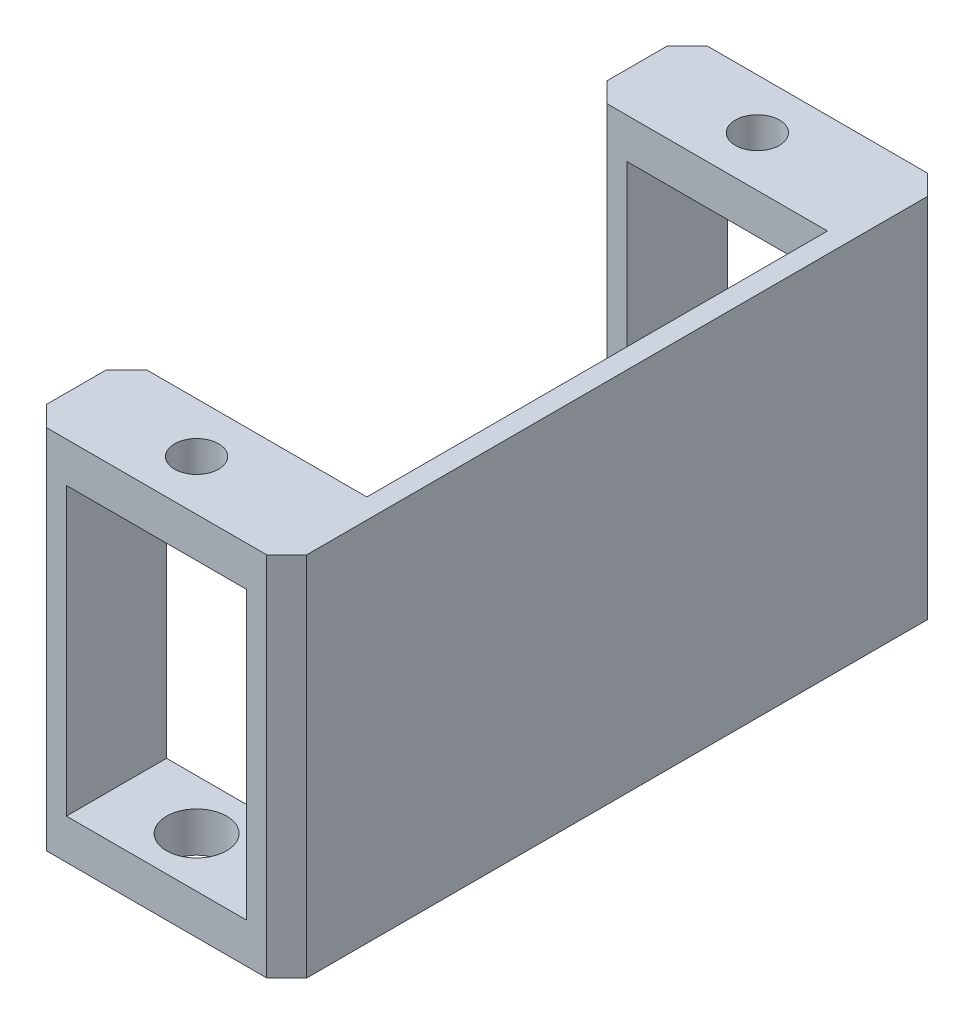
ISO-10303-21;
HEADER;
FILE_DESCRIPTION(('STEP AP214'),'2;1');
FILE_NAME('part.step','',(''),(''),'','','');
FILE_SCHEMA(('AUTOMOTIVE_DESIGN { 1 0 10303 214 1 1 1 1 }'));
ENDSEC;
DATA;
#1=APPLICATION_CONTEXT('core data for automotive mechanical design processes');
#2=APPLICATION_PROTOCOL_DEFINITION('international standard','automotive_design',2000,#1);
#3=PRODUCT_CONTEXT('',#1,'mechanical');
#4=PRODUCT('Part','Part','',(#3));
#5=PRODUCT_RELATED_PRODUCT_CATEGORY('part','',(#4));
#6=PRODUCT_DEFINITION_FORMATION('','',#4);
#7=PRODUCT_DEFINITION_CONTEXT('part definition',#1,'design');
#8=PRODUCT_DEFINITION('design','',#6,#7);
#9=PRODUCT_DEFINITION_SHAPE('','',#8);
#10=(LENGTH_UNIT() NAMED_UNIT(*) SI_UNIT(.MILLI.,.METRE.));
#11=(NAMED_UNIT(*) PLANE_ANGLE_UNIT() SI_UNIT($,.RADIAN.));
#12=(NAMED_UNIT(*) SI_UNIT($,.STERADIAN.) SOLID_ANGLE_UNIT());
#13=UNCERTAINTY_MEASURE_WITH_UNIT(LENGTH_MEASURE(1.E-05),#10,'distance_accuracy_value','');
#14=(GEOMETRIC_REPRESENTATION_CONTEXT(3) GLOBAL_UNCERTAINTY_ASSIGNED_CONTEXT((#13)) GLOBAL_UNIT_ASSIGNED_CONTEXT((#10,
#11,#12)) REPRESENTATION_CONTEXT('',''));
#15=CARTESIAN_POINT('',(0.,0.,0.));
#16=DIRECTION('',(0.,0.,1.));
#17=DIRECTION('',(1.,0.,0.));
#18=AXIS2_PLACEMENT_3D('',#15,#16,#17);
#19=CARTESIAN_POINT('',(0.,2.,0.));
#20=DIRECTION('',(0.,1.,0.));
#21=DIRECTION('',(0.,0.,1.));
#22=AXIS2_PLACEMENT_3D('',#19,#20,#21);
#23=PLANE('',#22);
#24=CARTESIAN_POINT('',(0.,2.,14.));
#25=DIRECTION('',(0.,1.,0.));
#26=DIRECTION('',(0.,0.,1.));
#27=AXIS2_PLACEMENT_3D('',#24,#25,#26);
#28=CIRCLE('',#27,1.5);
#29=CARTESIAN_POINT('',(0.,2.,15.5));
#30=VERTEX_POINT('',#29);
#31=EDGE_CURVE('E333',#30,#30,#28,.T.);
#32=ORIENTED_EDGE('',*,*,#31,.F.);
#33=EDGE_LOOP('',(#32));
#34=FACE_BOUND('',#33,.T.);
#35=DIRECTION('',(-1.,0.,0.));
#36=VECTOR('',#35,1.);
#37=CARTESIAN_POINT('',(-6.,2.,11.5));
#38=LINE('',#37,#36);
#39=CARTESIAN_POINT('',(5.00000000000001,2.,11.5));
#40=VERTEX_POINT('',#39);
#41=CARTESIAN_POINT('',(-4.00000000000001,2.,11.5));
#42=VERTEX_POINT('',#41);
#43=EDGE_CURVE('E349',#40,#42,#38,.T.);
#44=ORIENTED_EDGE('',*,*,#43,.T.);
#45=DIRECTION('',(0.,0.,-1.));
#46=VECTOR('',#45,1.);
#47=CARTESIAN_POINT('',(-4.00000000000001,2.,16.5));
#48=LINE('',#47,#46);
#49=CARTESIAN_POINT('',(-4.00000000000001,2.,16.5));
#50=VERTEX_POINT('',#49);
#51=EDGE_CURVE('E277',#50,#42,#48,.T.);
#52=ORIENTED_EDGE('',*,*,#51,.F.);
#53=DIRECTION('',(1.,0.,0.));
#54=VECTOR('',#53,1.);
#55=CARTESIAN_POINT('',(-6.,2.,16.5));
#56=LINE('',#55,#54);
#57=CARTESIAN_POINT('',(5.00000000000001,2.,16.5));
#58=VERTEX_POINT('',#57);
#59=EDGE_CURVE('E352',#50,#58,#56,.T.);
#60=ORIENTED_EDGE('',*,*,#59,.T.);
#61=DIRECTION('',(0.,0.,1.));
#62=VECTOR('',#61,1.);
#63=CARTESIAN_POINT('',(5.00000000000001,2.,16.5));
#64=LINE('',#63,#62);
#65=EDGE_CURVE('E301',#40,#58,#64,.T.);
#66=ORIENTED_EDGE('',*,*,#65,.F.);
#67=EDGE_LOOP('',(#44,#52,#60,#66));
#68=FACE_BOUND('',#67,.T.);
#69=ADVANCED_FACE('F47',(#34,#68),#23,.T.);
#70=CARTESIAN_POINT('',(0.,2.,-14.));
#71=DIRECTION('',(0.,1.,0.));
#72=DIRECTION('',(0.,0.,-1.));
#73=AXIS2_PLACEMENT_3D('',#70,#71,#72);
#74=CIRCLE('',#73,1.5);
#75=CARTESIAN_POINT('',(0.,2.,-15.5));
#76=VERTEX_POINT('',#75);
#77=EDGE_CURVE('E338',#76,#76,#74,.T.);
#78=ORIENTED_EDGE('',*,*,#77,.F.);
#79=EDGE_LOOP('',(#78));
#80=FACE_BOUND('',#79,.T.);
#81=DIRECTION('',(1.,0.,0.));
#82=VECTOR('',#81,1.);
#83=CARTESIAN_POINT('',(-6.,2.,-11.5));
#84=LINE('',#83,#82);
#85=CARTESIAN_POINT('',(-4.00000000000001,2.,-11.5));
#86=VERTEX_POINT('',#85);
#87=CARTESIAN_POINT('',(5.00000000000001,2.,-11.5));
#88=VERTEX_POINT('',#87);
#89=EDGE_CURVE('E224',#86,#88,#84,.T.);
#90=ORIENTED_EDGE('',*,*,#89,.T.);
#91=DIRECTION('',(0.,0.,1.));
#92=VECTOR('',#91,1.);
#93=CARTESIAN_POINT('',(5.00000000000001,2.,-16.5));
#94=LINE('',#93,#92);
#95=CARTESIAN_POINT('',(5.00000000000001,2.,-16.5));
#96=VERTEX_POINT('',#95);
#97=EDGE_CURVE('E305',#96,#88,#94,.T.);
#98=ORIENTED_EDGE('',*,*,#97,.F.);
#99=DIRECTION('',(-1.,0.,0.));
#100=VECTOR('',#99,1.);
#101=CARTESIAN_POINT('',(6.00000000000001,2.,-16.5));
#102=LINE('',#101,#100);
#103=CARTESIAN_POINT('',(-4.00000000000001,2.,-16.5));
#104=VERTEX_POINT('',#103);
#105=EDGE_CURVE('E355',#96,#104,#102,.T.);
#106=ORIENTED_EDGE('',*,*,#105,.T.);
#107=DIRECTION('',(0.,0.,-1.));
#108=VECTOR('',#107,1.);
#109=CARTESIAN_POINT('',(-4.00000000000001,2.,-16.5));
#110=LINE('',#109,#108);
#111=EDGE_CURVE('E310',#86,#104,#110,.T.);
#112=ORIENTED_EDGE('',*,*,#111,.F.);
#113=EDGE_LOOP('',(#90,#98,#106,#112));
#114=FACE_BOUND('',#113,.T.);
#115=ADVANCED_FACE('F498',(#80,#114),#23,.T.);
#116=CARTESIAN_POINT('',(6.,2.,-11.5));
#117=DIRECTION('',(1.,0.,0.));
#118=DIRECTION('',(0.,0.,-1.));
#119=AXIS2_PLACEMENT_3D('',#116,#117,#118);
#120=PLANE('',#119);
#121=DIRECTION('',(0.,0.,1.));
#122=VECTOR('',#121,1.);
#123=CARTESIAN_POINT('',(6.,0.,-11.5));
#124=LINE('',#123,#122);
#125=CARTESIAN_POINT('',(6.,0.,-11.5));
#126=VERTEX_POINT('',#125);
#127=CARTESIAN_POINT('',(6.,0.,11.5));
#128=VERTEX_POINT('',#127);
#129=EDGE_CURVE('E342',#126,#128,#124,.T.);
#130=ORIENTED_EDGE('',*,*,#129,.T.);
#131=DIRECTION('',(0.,-1.,0.));
#132=VECTOR('',#131,1.);
#133=CARTESIAN_POINT('',(6.,2.,11.5));
#134=LINE('',#133,#132);
#135=CARTESIAN_POINT('',(6.,18.3,11.5));
#136=VERTEX_POINT('',#135);
#137=EDGE_CURVE('E223',#136,#128,#134,.T.);
#138=ORIENTED_EDGE('',*,*,#137,.F.);
#139=DIRECTION('',(0.,0.,1.));
#140=VECTOR('',#139,1.);
#141=CARTESIAN_POINT('',(6.,18.3,-11.5));
#142=LINE('',#141,#140);
#143=CARTESIAN_POINT('',(6.,18.3,-11.5));
#144=VERTEX_POINT('',#143);
#145=EDGE_CURVE('E204',#144,#136,#142,.T.);
#146=ORIENTED_EDGE('',*,*,#145,.F.);
#147=DIRECTION('',(0.,-1.,0.));
#148=VECTOR('',#147,1.);
#149=CARTESIAN_POINT('',(6.,2.,-11.5));
#150=LINE('',#149,#148);
#151=EDGE_CURVE('E215',#144,#126,#150,.T.);
#152=ORIENTED_EDGE('',*,*,#151,.T.);
#153=EDGE_LOOP('',(#130,#138,#146,#152));
#154=FACE_BOUND('',#153,.T.);
#155=ADVANCED_FACE('F226',(#154),#120,.F.);
#156=CARTESIAN_POINT('',(-6.,2.,11.5));
#157=DIRECTION('',(0.,0.,1.));
#158=DIRECTION('',(1.,0.,0.));
#159=AXIS2_PLACEMENT_3D('',#156,#157,#158);
#160=PLANE('',#159);
#161=DIRECTION('',(0.,-1.,0.));
#162=VECTOR('',#161,1.);
#163=CARTESIAN_POINT('',(5.00000000000001,16.3,11.5));
#164=LINE('',#163,#162);
#165=CARTESIAN_POINT('',(5.00000000000001,16.3,11.5));
#166=VERTEX_POINT('',#165);
#167=EDGE_CURVE('E292',#166,#40,#164,.T.);
#168=ORIENTED_EDGE('',*,*,#167,.F.);
#169=DIRECTION('',(-1.,0.,0.));
#170=VECTOR('',#169,1.);
#171=CARTESIAN_POINT('',(-6.00000000000001,16.3,11.5));
#172=LINE('',#171,#170);
#173=CARTESIAN_POINT('',(-4.00000000000001,16.3,11.5));
#174=VERTEX_POINT('',#173);
#175=EDGE_CURVE('E257',#166,#174,#172,.T.);
#176=ORIENTED_EDGE('',*,*,#175,.T.);
#177=DIRECTION('',(0.,-1.,0.));
#178=VECTOR('',#177,1.);
#179=CARTESIAN_POINT('',(-4.00000000000001,16.3,11.5));
#180=LINE('',#179,#178);
#181=EDGE_CURVE('E272',#174,#42,#180,.T.);
#182=ORIENTED_EDGE('',*,*,#181,.T.);
#183=ORIENTED_EDGE('',*,*,#43,.F.);
#184=EDGE_LOOP('',(#168,#176,#182,#183));
#185=FACE_BOUND('',#184,.T.);
#186=DIRECTION('',(-1.,0.,0.));
#187=VECTOR('',#186,1.);
#188=CARTESIAN_POINT('',(-6.,0.,11.5));
#189=LINE('',#188,#187);
#190=CARTESIAN_POINT('',(-4.99999999999999,0.,11.5));
#191=VERTEX_POINT('',#190);
#192=EDGE_CURVE('E362',#128,#191,#189,.T.);
#193=ORIENTED_EDGE('',*,*,#192,.T.);
#194=DIRECTION('',(0.,1.,0.));
#195=VECTOR('',#194,1.);
#196=CARTESIAN_POINT('',(-4.99999999999999,2.,11.5));
#197=LINE('',#196,#195);
#198=CARTESIAN_POINT('',(-4.99999999999999,18.3,11.5));
#199=VERTEX_POINT('',#198);
#200=EDGE_CURVE('E437',#191,#199,#197,.T.);
#201=ORIENTED_EDGE('',*,*,#200,.T.);
#202=DIRECTION('',(-1.,0.,0.));
#203=VECTOR('',#202,1.);
#204=CARTESIAN_POINT('',(-6.00000000000001,18.3,11.5));
#205=LINE('',#204,#203);
#206=EDGE_CURVE('E229',#136,#199,#205,.T.);
#207=ORIENTED_EDGE('',*,*,#206,.F.);
#208=ORIENTED_EDGE('',*,*,#137,.T.);
#209=EDGE_LOOP('',(#193,#201,#207,#208));
#210=FACE_BOUND('',#209,.T.);
#211=ADVANCED_FACE('F531',(#185,#210),#160,.F.);
#212=CARTESIAN_POINT('',(-6.,2.,11.5));
#213=DIRECTION('',(1.,0.,0.));
#214=DIRECTION('',(0.,0.,-1.));
#215=AXIS2_PLACEMENT_3D('',#212,#213,#214);
#216=PLANE('',#215);
#217=DIRECTION('',(0.,0.,1.));
#218=VECTOR('',#217,1.);
#219=CARTESIAN_POINT('',(-6.,0.,11.5));
#220=LINE('',#219,#218);
#221=CARTESIAN_POINT('',(-6.,0.,12.5));
#222=VERTEX_POINT('',#221);
#223=CARTESIAN_POINT('',(-6.,0.,15.5));
#224=VERTEX_POINT('',#223);
#225=EDGE_CURVE('E366',#222,#224,#220,.T.);
#226=ORIENTED_EDGE('',*,*,#225,.T.);
#227=DIRECTION('',(0.,1.,0.));
#228=VECTOR('',#227,1.);
#229=CARTESIAN_POINT('',(-6.,2.,15.5));
#230=LINE('',#229,#228);
#231=CARTESIAN_POINT('',(-6.00000000000001,18.3,15.5));
#232=VERTEX_POINT('',#231);
#233=EDGE_CURVE('E418',#224,#232,#230,.T.);
#234=ORIENTED_EDGE('',*,*,#233,.T.);
#235=DIRECTION('',(0.,0.,1.));
#236=VECTOR('',#235,1.);
#237=CARTESIAN_POINT('',(-6.00000000000001,18.3,11.5));
#238=LINE('',#237,#236);
#239=CARTESIAN_POINT('',(-6.00000000000001,18.3,12.5));
#240=VERTEX_POINT('',#239);
#241=EDGE_CURVE('E232',#240,#232,#238,.T.);
#242=ORIENTED_EDGE('',*,*,#241,.F.);
#243=DIRECTION('',(0.,-1.,0.));
#244=VECTOR('',#243,1.);
#245=CARTESIAN_POINT('',(-6.,2.,12.5));
#246=LINE('',#245,#244);
#247=EDGE_CURVE('E414',#240,#222,#246,.T.);
#248=ORIENTED_EDGE('',*,*,#247,.T.);
#249=EDGE_LOOP('',(#226,#234,#242,#248));
#250=FACE_BOUND('',#249,.T.);
#251=ADVANCED_FACE('F527',(#250),#216,.F.);
#252=CARTESIAN_POINT('',(6.00000000000001,2.,16.5));
#253=DIRECTION('',(0.,0.,-1.));
#254=DIRECTION('',(-1.,0.,0.));
#255=AXIS2_PLACEMENT_3D('',#252,#253,#254);
#256=PLANE('',#255);
#257=DIRECTION('',(1.,0.,0.));
#258=VECTOR('',#257,1.);
#259=CARTESIAN_POINT('',(-6.00000000000001,18.3,16.5));
#260=LINE('',#259,#258);
#261=CARTESIAN_POINT('',(-5.,18.3,16.5));
#262=VERTEX_POINT('',#261);
#263=CARTESIAN_POINT('',(6.,18.3,16.5));
#264=VERTEX_POINT('',#263);
#265=EDGE_CURVE('E238',#262,#264,#260,.T.);
#266=ORIENTED_EDGE('',*,*,#265,.F.);
#267=DIRECTION('',(0.,-1.,0.));
#268=VECTOR('',#267,1.);
#269=CARTESIAN_POINT('',(-5.,2.,16.5));
#270=LINE('',#269,#268);
#271=CARTESIAN_POINT('',(-5.,0.,16.5));
#272=VERTEX_POINT('',#271);
#273=EDGE_CURVE('E392',#262,#272,#270,.T.);
#274=ORIENTED_EDGE('',*,*,#273,.T.);
#275=DIRECTION('',(1.,0.,0.));
#276=VECTOR('',#275,1.);
#277=CARTESIAN_POINT('',(6.00000000000001,0.,16.5));
#278=LINE('',#277,#276);
#279=CARTESIAN_POINT('',(6.,0.,16.5));
#280=VERTEX_POINT('',#279);
#281=EDGE_CURVE('E370',#272,#280,#278,.T.);
#282=ORIENTED_EDGE('',*,*,#281,.T.);
#283=DIRECTION('',(0.,1.,0.));
#284=VECTOR('',#283,1.);
#285=CARTESIAN_POINT('',(6.,2.,16.5));
#286=LINE('',#285,#284);
#287=EDGE_CURVE('E389',#280,#264,#286,.T.);
#288=ORIENTED_EDGE('',*,*,#287,.T.);
#289=EDGE_LOOP('',(#266,#274,#282,#288));
#290=FACE_BOUND('',#289,.T.);
#291=DIRECTION('',(1.,0.,0.));
#292=VECTOR('',#291,1.);
#293=CARTESIAN_POINT('',(-6.00000000000001,16.3,16.5));
#294=LINE('',#293,#292);
#295=CARTESIAN_POINT('',(-4.00000000000001,16.3,16.5));
#296=VERTEX_POINT('',#295);
#297=CARTESIAN_POINT('',(5.00000000000001,16.3,16.5));
#298=VERTEX_POINT('',#297);
#299=EDGE_CURVE('E262',#296,#298,#294,.T.);
#300=ORIENTED_EDGE('',*,*,#299,.T.);
#301=DIRECTION('',(0.,-1.,0.));
#302=VECTOR('',#301,1.);
#303=CARTESIAN_POINT('',(5.00000000000001,16.3,16.5));
#304=LINE('',#303,#302);
#305=EDGE_CURVE('E296',#298,#58,#304,.T.);
#306=ORIENTED_EDGE('',*,*,#305,.T.);
#307=ORIENTED_EDGE('',*,*,#59,.F.);
#308=DIRECTION('',(0.,-1.,0.));
#309=VECTOR('',#308,1.);
#310=CARTESIAN_POINT('',(-4.00000000000001,16.3,16.5));
#311=LINE('',#310,#309);
#312=EDGE_CURVE('E252',#296,#50,#311,.T.);
#313=ORIENTED_EDGE('',*,*,#312,.F.);
#314=EDGE_LOOP('',(#300,#306,#307,#313));
#315=FACE_BOUND('',#314,.T.);
#316=ADVANCED_FACE('F524',(#290,#315),#256,.F.);
#317=CARTESIAN_POINT('',(7.00000000000001,2.,-16.5));
#318=DIRECTION('',(-1.,0.,0.));
#319=DIRECTION('',(0.,0.,1.));
#320=AXIS2_PLACEMENT_3D('',#317,#318,#319);
#321=PLANE('',#320);
#322=DIRECTION('',(0.,0.,-1.));
#323=VECTOR('',#322,1.);
#324=CARTESIAN_POINT('',(7.00000000000001,0.,-16.5));
#325=LINE('',#324,#323);
#326=CARTESIAN_POINT('',(7.00000000000001,0.,15.5));
#327=VERTEX_POINT('',#326);
#328=CARTESIAN_POINT('',(7.00000000000001,0.,-15.5));
#329=VERTEX_POINT('',#328);
#330=EDGE_CURVE('E374',#327,#329,#325,.T.);
#331=ORIENTED_EDGE('',*,*,#330,.T.);
#332=DIRECTION('',(0.,1.,0.));
#333=VECTOR('',#332,1.);
#334=CARTESIAN_POINT('',(7.00000000000001,2.,-15.5));
#335=LINE('',#334,#333);
#336=CARTESIAN_POINT('',(7.00000000000001,18.3,-15.5));
#337=VERTEX_POINT('',#336);
#338=EDGE_CURVE('E11',#329,#337,#335,.T.);
#339=ORIENTED_EDGE('',*,*,#338,.T.);
#340=DIRECTION('',(0.,0.,-1.));
#341=VECTOR('',#340,1.);
#342=CARTESIAN_POINT('',(7.00000000000001,18.3,16.5));
#343=LINE('',#342,#341);
#344=CARTESIAN_POINT('',(7.00000000000001,18.3,15.5));
#345=VERTEX_POINT('',#344);
#346=EDGE_CURVE('E242',#345,#337,#343,.T.);
#347=ORIENTED_EDGE('',*,*,#346,.F.);
#348=DIRECTION('',(0.,-1.,0.));
#349=VECTOR('',#348,1.);
#350=CARTESIAN_POINT('',(7.00000000000001,2.,15.5));
#351=LINE('',#350,#349);
#352=EDGE_CURVE('E57',#345,#327,#351,.T.);
#353=ORIENTED_EDGE('',*,*,#352,.T.);
#354=EDGE_LOOP('',(#331,#339,#347,#353));
#355=FACE_BOUND('',#354,.T.);
#356=ADVANCED_FACE('F461',(#355),#321,.F.);
#357=CARTESIAN_POINT('',(-6.00000000000001,2.,-16.5));
#358=DIRECTION('',(0.,0.,1.));
#359=DIRECTION('',(1.,0.,0.));
#360=AXIS2_PLACEMENT_3D('',#357,#358,#359);
#361=PLANE('',#360);
#362=DIRECTION('',(-1.,0.,0.));
#363=VECTOR('',#362,1.);
#364=CARTESIAN_POINT('',(-6.00000000000001,0.,-16.5));
#365=LINE('',#364,#363);
#366=CARTESIAN_POINT('',(6.,0.,-16.5));
#367=VERTEX_POINT('',#366);
#368=CARTESIAN_POINT('',(-5.,0.,-16.5));
#369=VERTEX_POINT('',#368);
#370=EDGE_CURVE('E378',#367,#369,#365,.T.);
#371=ORIENTED_EDGE('',*,*,#370,.T.);
#372=DIRECTION('',(0.,1.,0.));
#373=VECTOR('',#372,1.);
#374=CARTESIAN_POINT('',(-5.,2.,-16.5));
#375=LINE('',#374,#373);
#376=CARTESIAN_POINT('',(-5.,18.3,-16.5));
#377=VERTEX_POINT('',#376);
#378=EDGE_CURVE('E453',#369,#377,#375,.T.);
#379=ORIENTED_EDGE('',*,*,#378,.T.);
#380=DIRECTION('',(-1.,0.,0.));
#381=VECTOR('',#380,1.);
#382=CARTESIAN_POINT('',(-6.00000000000001,18.3,-16.5));
#383=LINE('',#382,#381);
#384=CARTESIAN_POINT('',(6.,18.3,-16.5));
#385=VERTEX_POINT('',#384);
#386=EDGE_CURVE('E246',#385,#377,#383,.T.);
#387=ORIENTED_EDGE('',*,*,#386,.F.);
#388=DIRECTION('',(0.,-1.,0.));
#389=VECTOR('',#388,1.);
#390=CARTESIAN_POINT('',(6.,2.,-16.5));
#391=LINE('',#390,#389);
#392=EDGE_CURVE('E449',#385,#367,#391,.T.);
#393=ORIENTED_EDGE('',*,*,#392,.T.);
#394=EDGE_LOOP('',(#371,#379,#387,#393));
#395=FACE_BOUND('',#394,.T.);
#396=DIRECTION('',(-1.,0.,0.));
#397=VECTOR('',#396,1.);
#398=CARTESIAN_POINT('',(-6.00000000000001,16.3,-16.5));
#399=LINE('',#398,#397);
#400=CARTESIAN_POINT('',(5.00000000000001,16.3,-16.5));
#401=VERTEX_POINT('',#400);
#402=CARTESIAN_POINT('',(-4.00000000000001,16.3,-16.5));
#403=VERTEX_POINT('',#402);
#404=EDGE_CURVE('E212',#401,#403,#399,.T.);
#405=ORIENTED_EDGE('',*,*,#404,.T.);
#406=DIRECTION('',(0.,-1.,0.));
#407=VECTOR('',#406,1.);
#408=CARTESIAN_POINT('',(-4.00000000000001,16.3,-16.5));
#409=LINE('',#408,#407);
#410=EDGE_CURVE('E321',#403,#104,#409,.T.);
#411=ORIENTED_EDGE('',*,*,#410,.T.);
#412=ORIENTED_EDGE('',*,*,#105,.F.);
#413=DIRECTION('',(0.,-1.,0.));
#414=VECTOR('',#413,1.);
#415=CARTESIAN_POINT('',(5.00000000000001,16.3,-16.5));
#416=LINE('',#415,#414);
#417=EDGE_CURVE('E281',#401,#96,#416,.T.);
#418=ORIENTED_EDGE('',*,*,#417,.F.);
#419=EDGE_LOOP('',(#405,#411,#412,#418));
#420=FACE_BOUND('',#419,.T.);
#421=ADVANCED_FACE('F475',(#395,#420),#361,.F.);
#422=CARTESIAN_POINT('',(-6.,2.,-11.5));
#423=DIRECTION('',(1.,0.,0.));
#424=DIRECTION('',(0.,0.,-1.));
#425=AXIS2_PLACEMENT_3D('',#422,#423,#424);
#426=PLANE('',#425);
#427=DIRECTION('',(0.,0.,1.));
#428=VECTOR('',#427,1.);
#429=CARTESIAN_POINT('',(-6.,0.,-11.5));
#430=LINE('',#429,#428);
#431=CARTESIAN_POINT('',(-6.00000000000001,0.,-15.5));
#432=VERTEX_POINT('',#431);
#433=CARTESIAN_POINT('',(-6.,0.,-12.5));
#434=VERTEX_POINT('',#433);
#435=EDGE_CURVE('E382',#432,#434,#430,.T.);
#436=ORIENTED_EDGE('',*,*,#435,.T.);
#437=DIRECTION('',(0.,1.,0.));
#438=VECTOR('',#437,1.);
#439=CARTESIAN_POINT('',(-6.,2.,-12.5));
#440=LINE('',#439,#438);
#441=CARTESIAN_POINT('',(-6.00000000000001,18.3,-12.5));
#442=VERTEX_POINT('',#441);
#443=EDGE_CURVE('E64',#434,#442,#440,.T.);
#444=ORIENTED_EDGE('',*,*,#443,.T.);
#445=DIRECTION('',(0.,0.,1.));
#446=VECTOR('',#445,1.);
#447=CARTESIAN_POINT('',(-6.00000000000001,18.3,-16.5));
#448=LINE('',#447,#446);
#449=CARTESIAN_POINT('',(-6.00000000000001,18.3,-15.5));
#450=VERTEX_POINT('',#449);
#451=EDGE_CURVE('E249',#450,#442,#448,.T.);
#452=ORIENTED_EDGE('',*,*,#451,.F.);
#453=DIRECTION('',(0.,-1.,0.));
#454=VECTOR('',#453,1.);
#455=CARTESIAN_POINT('',(-6.00000000000001,2.,-15.5));
#456=LINE('',#455,#454);
#457=EDGE_CURVE('E443',#450,#432,#456,.T.);
#458=ORIENTED_EDGE('',*,*,#457,.T.);
#459=EDGE_LOOP('',(#436,#444,#452,#458));
#460=FACE_BOUND('',#459,.T.);
#461=ADVANCED_FACE('F482',(#460),#426,.F.);
#462=CARTESIAN_POINT('',(-6.,2.,-11.5));
#463=DIRECTION('',(0.,0.,-1.));
#464=DIRECTION('',(-1.,0.,0.));
#465=AXIS2_PLACEMENT_3D('',#462,#463,#464);
#466=PLANE('',#465);
#467=DIRECTION('',(0.,-1.,0.));
#468=VECTOR('',#467,1.);
#469=CARTESIAN_POINT('',(-4.00000000000001,16.3,-11.5));
#470=LINE('',#469,#468);
#471=CARTESIAN_POINT('',(-4.00000000000001,16.3,-11.5));
#472=VERTEX_POINT('',#471);
#473=EDGE_CURVE('E328',#472,#86,#470,.T.);
#474=ORIENTED_EDGE('',*,*,#473,.F.);
#475=DIRECTION('',(1.,0.,0.));
#476=VECTOR('',#475,1.);
#477=CARTESIAN_POINT('',(-6.00000000000001,16.3,-11.5));
#478=LINE('',#477,#476);
#479=CARTESIAN_POINT('',(5.00000000000001,16.3,-11.5));
#480=VERTEX_POINT('',#479);
#481=EDGE_CURVE('E253',#472,#480,#478,.T.);
#482=ORIENTED_EDGE('',*,*,#481,.T.);
#483=DIRECTION('',(0.,-1.,0.));
#484=VECTOR('',#483,1.);
#485=CARTESIAN_POINT('',(5.00000000000001,16.3,-11.5));
#486=LINE('',#485,#484);
#487=EDGE_CURVE('E288',#480,#88,#486,.T.);
#488=ORIENTED_EDGE('',*,*,#487,.T.);
#489=ORIENTED_EDGE('',*,*,#89,.F.);
#490=EDGE_LOOP('',(#474,#482,#488,#489));
#491=FACE_BOUND('',#490,.T.);
#492=DIRECTION('',(1.,0.,0.));
#493=VECTOR('',#492,1.);
#494=CARTESIAN_POINT('',(-6.00000000000001,18.3,-11.5));
#495=LINE('',#494,#493);
#496=CARTESIAN_POINT('',(-5.,18.3,-11.5));
#497=VERTEX_POINT('',#496);
#498=EDGE_CURVE('E198',#497,#144,#495,.T.);
#499=ORIENTED_EDGE('',*,*,#498,.F.);
#500=DIRECTION('',(0.,-1.,0.));
#501=VECTOR('',#500,1.);
#502=CARTESIAN_POINT('',(-5.,2.,-11.5));
#503=LINE('',#502,#501);
#504=CARTESIAN_POINT('',(-5.,0.,-11.5));
#505=VERTEX_POINT('',#504);
#506=EDGE_CURVE('E440',#497,#505,#503,.T.);
#507=ORIENTED_EDGE('',*,*,#506,.T.);
#508=DIRECTION('',(1.,0.,0.));
#509=VECTOR('',#508,1.);
#510=CARTESIAN_POINT('',(-6.,0.,-11.5));
#511=LINE('',#510,#509);
#512=EDGE_CURVE('E218',#505,#126,#511,.T.);
#513=ORIENTED_EDGE('',*,*,#512,.T.);
#514=ORIENTED_EDGE('',*,*,#151,.F.);
#515=EDGE_LOOP('',(#499,#507,#513,#514));
#516=FACE_BOUND('',#515,.T.);
#517=ADVANCED_FACE('F216',(#491,#516),#466,.F.);
#518=CARTESIAN_POINT('',(0.,0.,0.));
#519=DIRECTION('',(0.,1.,0.));
#520=DIRECTION('',(0.,0.,1.));
#521=AXIS2_PLACEMENT_3D('',#518,#519,#520);
#522=PLANE('',#521);
#523=CARTESIAN_POINT('',(0.,0.,14.));
#524=DIRECTION('',(0.,1.,0.));
#525=DIRECTION('',(0.,0.,1.));
#526=AXIS2_PLACEMENT_3D('',#523,#524,#525);
#527=CIRCLE('',#526,1.5);
#528=CARTESIAN_POINT('',(0.,0.,15.5));
#529=VERTEX_POINT('',#528);
#530=EDGE_CURVE('E337',#529,#529,#527,.F.);
#531=ORIENTED_EDGE('',*,*,#530,.F.);
#532=EDGE_LOOP('',(#531));
#533=FACE_BOUND('',#532,.T.);
#534=CARTESIAN_POINT('',(0.,0.,-14.));
#535=DIRECTION('',(0.,1.,0.));
#536=DIRECTION('',(0.,0.,1.));
#537=AXIS2_PLACEMENT_3D('',#534,#535,#536);
#538=CIRCLE('',#537,1.5);
#539=CARTESIAN_POINT('',(0.,0.,-12.5));
#540=VERTEX_POINT('',#539);
#541=EDGE_CURVE('E332',#540,#540,#538,.F.);
#542=ORIENTED_EDGE('',*,*,#541,.F.);
#543=EDGE_LOOP('',(#542));
#544=FACE_BOUND('',#543,.T.);
#545=ORIENTED_EDGE('',*,*,#281,.F.);
#546=DIRECTION('',(0.707106781186546,0.,0.707106781186549));
#547=VECTOR('',#546,1.);
#548=CARTESIAN_POINT('',(-5.,0.,16.5));
#549=LINE('',#548,#547);
#550=EDGE_CURVE('E411',#272,#224,#549,.F.);
#551=ORIENTED_EDGE('',*,*,#550,.T.);
#552=ORIENTED_EDGE('',*,*,#225,.F.);
#553=DIRECTION('',(-0.707106781186549,0.,0.707106781186546));
#554=VECTOR('',#553,1.);
#555=CARTESIAN_POINT('',(-6.,0.,12.5));
#556=LINE('',#555,#554);
#557=EDGE_CURVE('E408',#222,#191,#556,.F.);
#558=ORIENTED_EDGE('',*,*,#557,.T.);
#559=ORIENTED_EDGE('',*,*,#192,.F.);
#560=ORIENTED_EDGE('',*,*,#129,.F.);
#561=ORIENTED_EDGE('',*,*,#512,.F.);
#562=DIRECTION('',(0.707106781186548,0.,0.707106781186548));
#563=VECTOR('',#562,1.);
#564=CARTESIAN_POINT('',(-5.,0.,-11.5));
#565=LINE('',#564,#563);
#566=EDGE_CURVE('E405',#505,#434,#565,.F.);
#567=ORIENTED_EDGE('',*,*,#566,.T.);
#568=ORIENTED_EDGE('',*,*,#435,.F.);
#569=DIRECTION('',(-0.707106781186548,0.,0.707106781186548));
#570=VECTOR('',#569,1.);
#571=CARTESIAN_POINT('',(-6.00000000000001,0.,-15.5));
#572=LINE('',#571,#570);
#573=EDGE_CURVE('E402',#432,#369,#572,.F.);
#574=ORIENTED_EDGE('',*,*,#573,.T.);
#575=ORIENTED_EDGE('',*,*,#370,.F.);
#576=DIRECTION('',(-0.707106781186547,0.,-0.707106781186548));
#577=VECTOR('',#576,1.);
#578=CARTESIAN_POINT('',(6.,0.,-16.5));
#579=LINE('',#578,#577);
#580=EDGE_CURVE('E399',#367,#329,#579,.F.);
#581=ORIENTED_EDGE('',*,*,#580,.T.);
#582=ORIENTED_EDGE('',*,*,#330,.F.);
#583=DIRECTION('',(0.70710678118655,0.,-0.707106781186545));
#584=VECTOR('',#583,1.);
#585=CARTESIAN_POINT('',(7.00000000000001,0.,15.5));
#586=LINE('',#585,#584);
#587=EDGE_CURVE('E396',#327,#280,#586,.F.);
#588=ORIENTED_EDGE('',*,*,#587,.T.);
#589=EDGE_LOOP('',(#545,#551,#552,#558,#559,#560,#561,#567,#568,#574,#575,#581,#582,#588));
#590=FACE_BOUND('',#589,.T.);
#591=ADVANCED_FACE('F467',(#533,#544,#590),#522,.F.);
#592=CARTESIAN_POINT('',(0.,-0.00100000000000013,-14.));
#593=DIRECTION('',(0.,1.,0.));
#594=DIRECTION('',(0.,0.,1.));
#595=AXIS2_PLACEMENT_3D('',#592,#593,#594);
#596=CYLINDRICAL_SURFACE('',#595,1.5);
#597=ORIENTED_EDGE('',*,*,#77,.T.);
#598=EDGE_LOOP('',(#597));
#599=FACE_BOUND('',#598,.T.);
#600=ORIENTED_EDGE('',*,*,#541,.T.);
#601=EDGE_LOOP('',(#600));
#602=FACE_BOUND('',#601,.T.);
#603=ADVANCED_FACE('F510',(#599,#602),#596,.F.);
#604=CARTESIAN_POINT('',(0.,-0.00100000000000013,14.));
#605=DIRECTION('',(0.,1.,0.));
#606=DIRECTION('',(0.,0.,1.));
#607=AXIS2_PLACEMENT_3D('',#604,#605,#606);
#608=CYLINDRICAL_SURFACE('',#607,1.5);
#609=ORIENTED_EDGE('',*,*,#31,.T.);
#610=EDGE_LOOP('',(#609));
#611=FACE_BOUND('',#610,.T.);
#612=ORIENTED_EDGE('',*,*,#530,.T.);
#613=EDGE_LOOP('',(#612));
#614=FACE_BOUND('',#613,.T.);
#615=ADVANCED_FACE('F605',(#611,#614),#608,.F.);
#616=CARTESIAN_POINT('',(-4.00000000000001,16.3,-16.5));
#617=DIRECTION('',(-1.,0.,0.));
#618=DIRECTION('',(0.,0.,1.));
#619=AXIS2_PLACEMENT_3D('',#616,#617,#618);
#620=PLANE('',#619);
#621=ORIENTED_EDGE('',*,*,#111,.T.);
#622=ORIENTED_EDGE('',*,*,#410,.F.);
#623=DIRECTION('',(0.,0.,-1.));
#624=VECTOR('',#623,1.);
#625=CARTESIAN_POINT('',(-4.00000000000001,16.3,-16.5));
#626=LINE('',#625,#624);
#627=EDGE_CURVE('E317',#472,#403,#626,.T.);
#628=ORIENTED_EDGE('',*,*,#627,.F.);
#629=ORIENTED_EDGE('',*,*,#473,.T.);
#630=EDGE_LOOP('',(#621,#622,#628,#629));
#631=FACE_BOUND('',#630,.T.);
#632=ADVANCED_FACE('F601',(#631),#620,.F.);
#633=CARTESIAN_POINT('',(5.00000000000001,16.3,-16.5));
#634=DIRECTION('',(1.,0.,0.));
#635=DIRECTION('',(0.,0.,-1.));
#636=AXIS2_PLACEMENT_3D('',#633,#634,#635);
#637=PLANE('',#636);
#638=ORIENTED_EDGE('',*,*,#97,.T.);
#639=ORIENTED_EDGE('',*,*,#487,.F.);
#640=DIRECTION('',(0.,0.,1.));
#641=VECTOR('',#640,1.);
#642=CARTESIAN_POINT('',(5.00000000000001,16.3,-16.5));
#643=LINE('',#642,#641);
#644=EDGE_CURVE('E306',#401,#480,#643,.T.);
#645=ORIENTED_EDGE('',*,*,#644,.F.);
#646=ORIENTED_EDGE('',*,*,#417,.T.);
#647=EDGE_LOOP('',(#638,#639,#645,#646));
#648=FACE_BOUND('',#647,.T.);
#649=ADVANCED_FACE('F596',(#648),#637,.F.);
#650=CARTESIAN_POINT('',(5.00000000000001,16.3,16.5));
#651=DIRECTION('',(1.,0.,0.));
#652=DIRECTION('',(0.,0.,-1.));
#653=AXIS2_PLACEMENT_3D('',#650,#651,#652);
#654=PLANE('',#653);
#655=ORIENTED_EDGE('',*,*,#65,.T.);
#656=ORIENTED_EDGE('',*,*,#305,.F.);
#657=DIRECTION('',(0.,0.,1.));
#658=VECTOR('',#657,1.);
#659=CARTESIAN_POINT('',(5.00000000000001,16.3,16.5));
#660=LINE('',#659,#658);
#661=EDGE_CURVE('E300',#166,#298,#660,.T.);
#662=ORIENTED_EDGE('',*,*,#661,.F.);
#663=ORIENTED_EDGE('',*,*,#167,.T.);
#664=EDGE_LOOP('',(#655,#656,#662,#663));
#665=FACE_BOUND('',#664,.T.);
#666=ADVANCED_FACE('F582',(#665),#654,.F.);
#667=CARTESIAN_POINT('',(-4.00000000000001,16.3,16.5));
#668=DIRECTION('',(-1.,0.,0.));
#669=DIRECTION('',(0.,0.,1.));
#670=AXIS2_PLACEMENT_3D('',#667,#668,#669);
#671=PLANE('',#670);
#672=ORIENTED_EDGE('',*,*,#51,.T.);
#673=ORIENTED_EDGE('',*,*,#181,.F.);
#674=DIRECTION('',(0.,0.,-1.));
#675=VECTOR('',#674,1.);
#676=CARTESIAN_POINT('',(-4.00000000000001,16.3,16.5));
#677=LINE('',#676,#675);
#678=EDGE_CURVE('E276',#296,#174,#677,.T.);
#679=ORIENTED_EDGE('',*,*,#678,.F.);
#680=ORIENTED_EDGE('',*,*,#312,.T.);
#681=EDGE_LOOP('',(#672,#673,#679,#680));
#682=FACE_BOUND('',#681,.T.);
#683=ADVANCED_FACE('F586',(#682),#671,.F.);
#684=CARTESIAN_POINT('',(0.,16.3,0.));
#685=DIRECTION('',(0.,-1.,0.));
#686=DIRECTION('',(0.,0.,-1.));
#687=AXIS2_PLACEMENT_3D('',#684,#685,#686);
#688=PLANE('',#687);
#689=CARTESIAN_POINT('',(0.,16.3,-14.));
#690=DIRECTION('',(0.,-1.,0.));
#691=DIRECTION('',(0.,0.,-1.));
#692=AXIS2_PLACEMENT_3D('',#689,#690,#691);
#693=CIRCLE('',#692,1.1);
#694=CARTESIAN_POINT('',(0.,16.3,-15.1));
#695=VERTEX_POINT('',#694);
#696=EDGE_CURVE('E851',#695,#695,#693,.F.);
#697=ORIENTED_EDGE('',*,*,#696,.T.);
#698=EDGE_LOOP('',(#697));
#699=FACE_BOUND('',#698,.T.);
#700=ORIENTED_EDGE('',*,*,#627,.T.);
#701=ORIENTED_EDGE('',*,*,#404,.F.);
#702=ORIENTED_EDGE('',*,*,#644,.T.);
#703=ORIENTED_EDGE('',*,*,#481,.F.);
#704=EDGE_LOOP('',(#700,#701,#702,#703));
#705=FACE_BOUND('',#704,.T.);
#706=ADVANCED_FACE('F588',(#699,#705),#688,.T.);
#707=CARTESIAN_POINT('',(0.,16.3,14.));
#708=DIRECTION('',(0.,-1.,0.));
#709=DIRECTION('',(0.,0.,-1.));
#710=AXIS2_PLACEMENT_3D('',#707,#708,#709);
#711=CIRCLE('',#710,1.1);
#712=CARTESIAN_POINT('',(0.,16.3,12.9));
#713=VERTEX_POINT('',#712);
#714=EDGE_CURVE('E857',#713,#713,#711,.F.);
#715=ORIENTED_EDGE('',*,*,#714,.T.);
#716=EDGE_LOOP('',(#715));
#717=FACE_BOUND('',#716,.T.);
#718=ORIENTED_EDGE('',*,*,#661,.T.);
#719=ORIENTED_EDGE('',*,*,#299,.F.);
#720=ORIENTED_EDGE('',*,*,#678,.T.);
#721=ORIENTED_EDGE('',*,*,#175,.F.);
#722=EDGE_LOOP('',(#718,#719,#720,#721));
#723=FACE_BOUND('',#722,.T.);
#724=ADVANCED_FACE('F578',(#717,#723),#688,.T.);
#725=CARTESIAN_POINT('',(0.,18.3,0.));
#726=DIRECTION('',(0.,-1.,0.));
#727=DIRECTION('',(0.,0.,-1.));
#728=AXIS2_PLACEMENT_3D('',#725,#726,#727);
#729=PLANE('',#728);
#730=CARTESIAN_POINT('',(0.,18.3,-14.));
#731=DIRECTION('',(0.,1.,0.));
#732=DIRECTION('',(0.,0.,1.));
#733=AXIS2_PLACEMENT_3D('',#730,#731,#732);
#734=CIRCLE('',#733,1.1);
#735=CARTESIAN_POINT('',(0.,18.3,-12.9));
#736=VERTEX_POINT('',#735);
#737=EDGE_CURVE('E258',#736,#736,#734,.T.);
#738=ORIENTED_EDGE('',*,*,#737,.F.);
#739=EDGE_LOOP('',(#738));
#740=FACE_BOUND('',#739,.T.);
#741=CARTESIAN_POINT('',(0.,18.3,14.));
#742=DIRECTION('',(0.,1.,0.));
#743=DIRECTION('',(0.,0.,1.));
#744=AXIS2_PLACEMENT_3D('',#741,#742,#743);
#745=CIRCLE('',#744,1.1);
#746=CARTESIAN_POINT('',(0.,18.3,15.1));
#747=VERTEX_POINT('',#746);
#748=EDGE_CURVE('E862',#747,#747,#745,.T.);
#749=ORIENTED_EDGE('',*,*,#748,.F.);
#750=EDGE_LOOP('',(#749));
#751=FACE_BOUND('',#750,.T.);
#752=ORIENTED_EDGE('',*,*,#241,.T.);
#753=DIRECTION('',(-0.707106781186546,0.,-0.707106781186549));
#754=VECTOR('',#753,1.);
#755=CARTESIAN_POINT('',(-5.,18.3,16.5));
#756=LINE('',#755,#754);
#757=EDGE_CURVE('E434',#232,#262,#756,.F.);
#758=ORIENTED_EDGE('',*,*,#757,.T.);
#759=ORIENTED_EDGE('',*,*,#265,.T.);
#760=DIRECTION('',(-0.70710678118655,0.,0.707106781186545));
#761=VECTOR('',#760,1.);
#762=CARTESIAN_POINT('',(7.00000000000001,18.3,15.5));
#763=LINE('',#762,#761);
#764=EDGE_CURVE('E421',#264,#345,#763,.F.);
#765=ORIENTED_EDGE('',*,*,#764,.T.);
#766=ORIENTED_EDGE('',*,*,#346,.T.);
#767=DIRECTION('',(0.707106781186547,0.,0.707106781186548));
#768=VECTOR('',#767,1.);
#769=CARTESIAN_POINT('',(6.,18.3,-16.5));
#770=LINE('',#769,#768);
#771=EDGE_CURVE('E424',#337,#385,#770,.F.);
#772=ORIENTED_EDGE('',*,*,#771,.T.);
#773=ORIENTED_EDGE('',*,*,#386,.T.);
#774=DIRECTION('',(0.707106781186548,0.,-0.707106781186548));
#775=VECTOR('',#774,1.);
#776=CARTESIAN_POINT('',(-6.00000000000001,18.3,-15.5));
#777=LINE('',#776,#775);
#778=EDGE_CURVE('E71',#377,#450,#777,.F.);
#779=ORIENTED_EDGE('',*,*,#778,.T.);
#780=ORIENTED_EDGE('',*,*,#451,.T.);
#781=DIRECTION('',(-0.707106781186548,0.,-0.707106781186548));
#782=VECTOR('',#781,1.);
#783=CARTESIAN_POINT('',(-5.,18.3,-11.5));
#784=LINE('',#783,#782);
#785=EDGE_CURVE('E207',#442,#497,#784,.F.);
#786=ORIENTED_EDGE('',*,*,#785,.T.);
#787=ORIENTED_EDGE('',*,*,#498,.T.);
#788=ORIENTED_EDGE('',*,*,#145,.T.);
#789=ORIENTED_EDGE('',*,*,#206,.T.);
#790=DIRECTION('',(0.707106781186549,0.,-0.707106781186546));
#791=VECTOR('',#790,1.);
#792=CARTESIAN_POINT('',(-6.,18.3,12.5));
#793=LINE('',#792,#791);
#794=EDGE_CURVE('E431',#199,#240,#793,.F.);
#795=ORIENTED_EDGE('',*,*,#794,.T.);
#796=EDGE_LOOP('',(#752,#758,#759,#765,#766,#772,#773,#779,#780,#786,#787,#788,#789,#795));
#797=FACE_BOUND('',#796,.T.);
#798=ADVANCED_FACE('F201',(#740,#751,#797),#729,.F.);
#799=CARTESIAN_POINT('',(0.,-0.001000000000001,14.));
#800=DIRECTION('',(0.,1.,0.));
#801=DIRECTION('',(0.,0.,1.));
#802=AXIS2_PLACEMENT_3D('',#799,#800,#801);
#803=CYLINDRICAL_SURFACE('',#802,1.1);
#804=ORIENTED_EDGE('',*,*,#714,.F.);
#805=EDGE_LOOP('',(#804));
#806=FACE_BOUND('',#805,.T.);
#807=ORIENTED_EDGE('',*,*,#748,.T.);
#808=EDGE_LOOP('',(#807));
#809=FACE_BOUND('',#808,.T.);
#810=ADVANCED_FACE('F786',(#806,#809),#803,.F.);
#811=CARTESIAN_POINT('',(0.,-0.001000000000001,-14.));
#812=DIRECTION('',(0.,1.,0.));
#813=DIRECTION('',(0.,0.,1.));
#814=AXIS2_PLACEMENT_3D('',#811,#812,#813);
#815=CYLINDRICAL_SURFACE('',#814,1.1);
#816=ORIENTED_EDGE('',*,*,#696,.F.);
#817=EDGE_LOOP('',(#816));
#818=FACE_BOUND('',#817,.T.);
#819=ORIENTED_EDGE('',*,*,#737,.T.);
#820=EDGE_LOOP('',(#819));
#821=FACE_BOUND('',#820,.T.);
#822=ADVANCED_FACE('F543',(#818,#821),#815,.F.);
#823=CARTESIAN_POINT('',(-5.,2.,16.5));
#824=DIRECTION('',(0.707106781186549,0.,-0.707106781186546));
#825=DIRECTION('',(0.,-1.,0.));
#826=AXIS2_PLACEMENT_3D('',#823,#824,#825);
#827=PLANE('',#826);
#828=ORIENTED_EDGE('',*,*,#757,.F.);
#829=ORIENTED_EDGE('',*,*,#233,.F.);
#830=ORIENTED_EDGE('',*,*,#550,.F.);
#831=ORIENTED_EDGE('',*,*,#273,.F.);
#832=EDGE_LOOP('',(#828,#829,#830,#831));
#833=FACE_BOUND('',#832,.T.);
#834=ADVANCED_FACE('F493',(#833),#827,.F.);
#835=CARTESIAN_POINT('',(-6.,2.,12.5));
#836=DIRECTION('',(0.707106781186546,0.,0.707106781186549));
#837=DIRECTION('',(0.,-1.,0.));
#838=AXIS2_PLACEMENT_3D('',#835,#836,#837);
#839=PLANE('',#838);
#840=ORIENTED_EDGE('',*,*,#794,.F.);
#841=ORIENTED_EDGE('',*,*,#200,.F.);
#842=ORIENTED_EDGE('',*,*,#557,.F.);
#843=ORIENTED_EDGE('',*,*,#247,.F.);
#844=EDGE_LOOP('',(#840,#841,#842,#843));
#845=FACE_BOUND('',#844,.T.);
#846=ADVANCED_FACE('F486',(#845),#839,.F.);
#847=CARTESIAN_POINT('',(-5.,2.,-11.5));
#848=DIRECTION('',(0.707106781186548,0.,-0.707106781186548));
#849=DIRECTION('',(0.,-1.,0.));
#850=AXIS2_PLACEMENT_3D('',#847,#848,#849);
#851=PLANE('',#850);
#852=ORIENTED_EDGE('',*,*,#785,.F.);
#853=ORIENTED_EDGE('',*,*,#443,.F.);
#854=ORIENTED_EDGE('',*,*,#566,.F.);
#855=ORIENTED_EDGE('',*,*,#506,.F.);
#856=EDGE_LOOP('',(#852,#853,#854,#855));
#857=FACE_BOUND('',#856,.T.);
#858=ADVANCED_FACE('F484',(#857),#851,.F.);
#859=CARTESIAN_POINT('',(-6.00000000000001,2.,-15.5));
#860=DIRECTION('',(0.707106781186547,0.,0.707106781186547));
#861=DIRECTION('',(0.,-1.,0.));
#862=AXIS2_PLACEMENT_3D('',#859,#860,#861);
#863=PLANE('',#862);
#864=ORIENTED_EDGE('',*,*,#778,.F.);
#865=ORIENTED_EDGE('',*,*,#378,.F.);
#866=ORIENTED_EDGE('',*,*,#573,.F.);
#867=ORIENTED_EDGE('',*,*,#457,.F.);
#868=EDGE_LOOP('',(#864,#865,#866,#867));
#869=FACE_BOUND('',#868,.T.);
#870=ADVANCED_FACE('F480',(#869),#863,.F.);
#871=CARTESIAN_POINT('',(6.,2.,-16.5));
#872=DIRECTION('',(-0.707106781186548,0.,0.707106781186547));
#873=DIRECTION('',(0.,-1.,0.));
#874=AXIS2_PLACEMENT_3D('',#871,#872,#873);
#875=PLANE('',#874);
#876=ORIENTED_EDGE('',*,*,#771,.F.);
#877=ORIENTED_EDGE('',*,*,#338,.F.);
#878=ORIENTED_EDGE('',*,*,#580,.F.);
#879=ORIENTED_EDGE('',*,*,#392,.F.);
#880=EDGE_LOOP('',(#876,#877,#878,#879));
#881=FACE_BOUND('',#880,.T.);
#882=ADVANCED_FACE('F472',(#881),#875,.F.);
#883=CARTESIAN_POINT('',(7.00000000000001,2.,15.5));
#884=DIRECTION('',(-0.707106781186545,0.,-0.70710678118655));
#885=DIRECTION('',(0.,-1.,0.));
#886=AXIS2_PLACEMENT_3D('',#883,#884,#885);
#887=PLANE('',#886);
#888=ORIENTED_EDGE('',*,*,#764,.F.);
#889=ORIENTED_EDGE('',*,*,#287,.F.);
#890=ORIENTED_EDGE('',*,*,#587,.F.);
#891=ORIENTED_EDGE('',*,*,#352,.F.);
#892=EDGE_LOOP('',(#888,#889,#890,#891));
#893=FACE_BOUND('',#892,.T.);
#894=ADVANCED_FACE('F50',(#893),#887,.F.);
#895=CLOSED_SHELL('',(#69,#115,#155,#211,#251,#316,#356,#421,#461,#517,#591,#603,#615,#632,#649,
#666,#683,#706,#724,#798,#810,#822,#834,#846,#858,#870,#882,#894));
#896=MANIFOLD_SOLID_BREP('B2',#895);
#897=ADVANCED_BREP_SHAPE_REPRESENTATION('',(#18,#896),#14);
#898=SHAPE_DEFINITION_REPRESENTATION(#9,#897);
ENDSEC;
END-ISO-10303-21;
